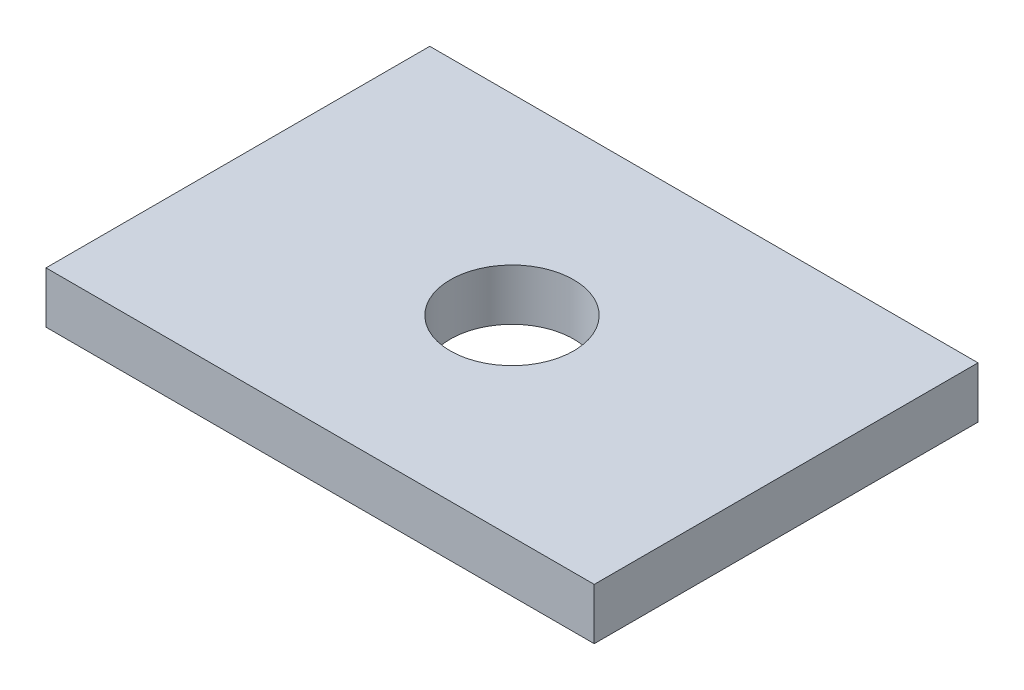
ISO-10303-21;
HEADER;
FILE_DESCRIPTION(('STEP AP214'),'2;1');
FILE_NAME('part.step','',(''),(''),'','','');
FILE_SCHEMA(('AUTOMOTIVE_DESIGN { 1 0 10303 214 1 1 1 1 }'));
ENDSEC;
DATA;
#1=APPLICATION_CONTEXT('core data for automotive mechanical design processes');
#2=APPLICATION_PROTOCOL_DEFINITION('international standard','automotive_design',2000,#1);
#3=PRODUCT_CONTEXT('',#1,'mechanical');
#4=PRODUCT('Part','Part','',(#3));
#5=PRODUCT_RELATED_PRODUCT_CATEGORY('part','',(#4));
#6=PRODUCT_DEFINITION_FORMATION('','',#4);
#7=PRODUCT_DEFINITION_CONTEXT('part definition',#1,'design');
#8=PRODUCT_DEFINITION('design','',#6,#7);
#9=PRODUCT_DEFINITION_SHAPE('','',#8);
#10=(LENGTH_UNIT() NAMED_UNIT(*) SI_UNIT(.MILLI.,.METRE.));
#11=(NAMED_UNIT(*) PLANE_ANGLE_UNIT() SI_UNIT($,.RADIAN.));
#12=(NAMED_UNIT(*) SI_UNIT($,.STERADIAN.) SOLID_ANGLE_UNIT());
#13=UNCERTAINTY_MEASURE_WITH_UNIT(LENGTH_MEASURE(1.E-05),#10,'distance_accuracy_value','');
#14=(GEOMETRIC_REPRESENTATION_CONTEXT(3) GLOBAL_UNCERTAINTY_ASSIGNED_CONTEXT((#13)) GLOBAL_UNIT_ASSIGNED_CONTEXT((#10,
#11,#12)) REPRESENTATION_CONTEXT('',''));
#15=CARTESIAN_POINT('',(0.,0.,0.));
#16=DIRECTION('',(0.,0.,1.));
#17=DIRECTION('',(1.,0.,0.));
#18=AXIS2_PLACEMENT_3D('',#15,#16,#17);
#19=CARTESIAN_POINT('',(0.,11.9062500000001,0.));
#20=DIRECTION('',(0.,-1.,0.));
#21=DIRECTION('',(0.,0.,-1.));
#22=AXIS2_PLACEMENT_3D('',#19,#20,#21);
#23=PLANE('',#22);
#24=DIRECTION('',(0.,0.,1.));
#25=VECTOR('',#24,1.);
#26=CARTESIAN_POINT('',(0.,11.9062500000001,0.));
#27=LINE('',#26,#25);
#28=CARTESIAN_POINT('',(0.,11.90625,-88.9));
#29=VERTEX_POINT('',#28);
#30=CARTESIAN_POINT('',(0.,11.9062500000001,0.));
#31=VERTEX_POINT('',#30);
#32=EDGE_CURVE('E85',#29,#31,#27,.T.);
#33=ORIENTED_EDGE('',*,*,#32,.T.);
#34=DIRECTION('',(1.,0.,0.));
#35=VECTOR('',#34,1.);
#36=CARTESIAN_POINT('',(0.,11.9062500000001,0.));
#37=LINE('',#36,#35);
#38=CARTESIAN_POINT('',(127.,11.9062500000001,0.));
#39=VERTEX_POINT('',#38);
#40=EDGE_CURVE('E80',#31,#39,#37,.T.);
#41=ORIENTED_EDGE('',*,*,#40,.T.);
#42=DIRECTION('',(0.,0.,-1.));
#43=VECTOR('',#42,1.);
#44=CARTESIAN_POINT('',(127.,11.9062500000001,0.));
#45=LINE('',#44,#43);
#46=CARTESIAN_POINT('',(127.,11.90625,-88.9));
#47=VERTEX_POINT('',#46);
#48=EDGE_CURVE('E83',#39,#47,#45,.T.);
#49=ORIENTED_EDGE('',*,*,#48,.T.);
#50=DIRECTION('',(-1.,0.,0.));
#51=VECTOR('',#50,1.);
#52=CARTESIAN_POINT('',(0.,11.90625,-88.9));
#53=LINE('',#52,#51);
#54=EDGE_CURVE('E50',#47,#29,#53,.T.);
#55=ORIENTED_EDGE('',*,*,#54,.T.);
#56=EDGE_LOOP('',(#33,#41,#49,#55));
#57=FACE_BOUND('',#56,.T.);
#58=CARTESIAN_POINT('',(63.5,11.90625,-44.45));
#59=DIRECTION('',(0.,1.,0.));
#60=DIRECTION('',(0.,0.,1.));
#61=AXIS2_PLACEMENT_3D('',#58,#59,#60);
#62=CIRCLE('',#61,14.2875);
#63=CARTESIAN_POINT('',(63.5,11.90625,-30.1625));
#64=VERTEX_POINT('',#63);
#65=EDGE_CURVE('E100',#64,#64,#62,.T.);
#66=ORIENTED_EDGE('',*,*,#65,.F.);
#67=EDGE_LOOP('',(#66));
#68=FACE_BOUND('',#67,.T.);
#69=ADVANCED_FACE('F33',(#57,#68),#23,.F.);
#70=CARTESIAN_POINT('',(0.,0.,0.));
#71=DIRECTION('',(0.,-1.,0.));
#72=DIRECTION('',(0.,0.,-1.));
#73=AXIS2_PLACEMENT_3D('',#70,#71,#72);
#74=PLANE('',#73);
#75=DIRECTION('',(0.,0.,1.));
#76=VECTOR('',#75,1.);
#77=CARTESIAN_POINT('',(0.,0.,0.));
#78=LINE('',#77,#76);
#79=CARTESIAN_POINT('',(0.,0.,-88.9));
#80=VERTEX_POINT('',#79);
#81=CARTESIAN_POINT('',(0.,0.,0.));
#82=VERTEX_POINT('',#81);
#83=EDGE_CURVE('E97',#80,#82,#78,.T.);
#84=ORIENTED_EDGE('',*,*,#83,.F.);
#85=DIRECTION('',(-1.,0.,0.));
#86=VECTOR('',#85,1.);
#87=CARTESIAN_POINT('',(0.,0.,-88.9));
#88=LINE('',#87,#86);
#89=CARTESIAN_POINT('',(127.,0.,-88.9));
#90=VERTEX_POINT('',#89);
#91=EDGE_CURVE('E73',#90,#80,#88,.T.);
#92=ORIENTED_EDGE('',*,*,#91,.F.);
#93=DIRECTION('',(0.,0.,-1.));
#94=VECTOR('',#93,1.);
#95=CARTESIAN_POINT('',(127.,0.,0.));
#96=LINE('',#95,#94);
#97=CARTESIAN_POINT('',(127.,0.,0.));
#98=VERTEX_POINT('',#97);
#99=EDGE_CURVE('E67',#98,#90,#96,.T.);
#100=ORIENTED_EDGE('',*,*,#99,.F.);
#101=DIRECTION('',(1.,0.,0.));
#102=VECTOR('',#101,1.);
#103=CARTESIAN_POINT('',(0.,0.,0.));
#104=LINE('',#103,#102);
#105=EDGE_CURVE('E89',#82,#98,#104,.T.);
#106=ORIENTED_EDGE('',*,*,#105,.F.);
#107=EDGE_LOOP('',(#84,#92,#100,#106));
#108=FACE_BOUND('',#107,.T.);
#109=CARTESIAN_POINT('',(63.5,0.,-44.45));
#110=DIRECTION('',(0.,1.,0.));
#111=DIRECTION('',(0.,0.,1.));
#112=AXIS2_PLACEMENT_3D('',#109,#110,#111);
#113=CIRCLE('',#112,14.2875);
#114=CARTESIAN_POINT('',(63.5,0.,-30.1625));
#115=VERTEX_POINT('',#114);
#116=EDGE_CURVE('E112',#115,#115,#113,.T.);
#117=ORIENTED_EDGE('',*,*,#116,.T.);
#118=EDGE_LOOP('',(#117));
#119=FACE_BOUND('',#118,.T.);
#120=ADVANCED_FACE('F108',(#108,#119),#74,.T.);
#121=CARTESIAN_POINT('',(0.,11.9062500000001,0.));
#122=DIRECTION('',(1.,0.,0.));
#123=DIRECTION('',(0.,0.,-1.));
#124=AXIS2_PLACEMENT_3D('',#121,#122,#123);
#125=PLANE('',#124);
#126=ORIENTED_EDGE('',*,*,#83,.T.);
#127=DIRECTION('',(0.,-1.,0.));
#128=VECTOR('',#127,1.);
#129=CARTESIAN_POINT('',(0.,11.9062500000001,0.));
#130=LINE('',#129,#128);
#131=EDGE_CURVE('E11',#31,#82,#130,.T.);
#132=ORIENTED_EDGE('',*,*,#131,.F.);
#133=ORIENTED_EDGE('',*,*,#32,.F.);
#134=DIRECTION('',(0.,-1.,0.));
#135=VECTOR('',#134,1.);
#136=CARTESIAN_POINT('',(0.,11.90625,-88.9));
#137=LINE('',#136,#135);
#138=EDGE_CURVE('E93',#29,#80,#137,.T.);
#139=ORIENTED_EDGE('',*,*,#138,.T.);
#140=EDGE_LOOP('',(#126,#132,#133,#139));
#141=FACE_BOUND('',#140,.T.);
#142=ADVANCED_FACE('F35',(#141),#125,.F.);
#143=CARTESIAN_POINT('',(0.,11.9062500000001,0.));
#144=DIRECTION('',(0.,0.,-1.));
#145=DIRECTION('',(-1.,0.,0.));
#146=AXIS2_PLACEMENT_3D('',#143,#144,#145);
#147=PLANE('',#146);
#148=ORIENTED_EDGE('',*,*,#105,.T.);
#149=DIRECTION('',(0.,-1.,0.));
#150=VECTOR('',#149,1.);
#151=CARTESIAN_POINT('',(127.,11.9062500000001,0.));
#152=LINE('',#151,#150);
#153=EDGE_CURVE('E42',#39,#98,#152,.T.);
#154=ORIENTED_EDGE('',*,*,#153,.F.);
#155=ORIENTED_EDGE('',*,*,#40,.F.);
#156=ORIENTED_EDGE('',*,*,#131,.T.);
#157=EDGE_LOOP('',(#148,#154,#155,#156));
#158=FACE_BOUND('',#157,.T.);
#159=ADVANCED_FACE('F88',(#158),#147,.F.);
#160=CARTESIAN_POINT('',(127.,11.9062500000001,0.));
#161=DIRECTION('',(-1.,0.,0.));
#162=DIRECTION('',(0.,0.,1.));
#163=AXIS2_PLACEMENT_3D('',#160,#161,#162);
#164=PLANE('',#163);
#165=ORIENTED_EDGE('',*,*,#99,.T.);
#166=DIRECTION('',(0.,-1.,0.));
#167=VECTOR('',#166,1.);
#168=CARTESIAN_POINT('',(127.,11.90625,-88.9));
#169=LINE('',#168,#167);
#170=EDGE_CURVE('E90',#47,#90,#169,.T.);
#171=ORIENTED_EDGE('',*,*,#170,.F.);
#172=ORIENTED_EDGE('',*,*,#48,.F.);
#173=ORIENTED_EDGE('',*,*,#153,.T.);
#174=EDGE_LOOP('',(#165,#171,#172,#173));
#175=FACE_BOUND('',#174,.T.);
#176=ADVANCED_FACE('F91',(#175),#164,.F.);
#177=CARTESIAN_POINT('',(0.,11.90625,-88.9));
#178=DIRECTION('',(0.,0.,1.));
#179=DIRECTION('',(1.,0.,0.));
#180=AXIS2_PLACEMENT_3D('',#177,#178,#179);
#181=PLANE('',#180);
#182=ORIENTED_EDGE('',*,*,#91,.T.);
#183=ORIENTED_EDGE('',*,*,#138,.F.);
#184=ORIENTED_EDGE('',*,*,#54,.F.);
#185=ORIENTED_EDGE('',*,*,#170,.T.);
#186=EDGE_LOOP('',(#182,#183,#184,#185));
#187=FACE_BOUND('',#186,.T.);
#188=ADVANCED_FACE('F105',(#187),#181,.F.);
#189=CARTESIAN_POINT('',(63.5,11.90625,-44.45));
#190=DIRECTION('',(0.,-1.,0.));
#191=DIRECTION('',(0.,0.,-1.));
#192=AXIS2_PLACEMENT_3D('',#189,#190,#191);
#193=CYLINDRICAL_SURFACE('',#192,14.2875);
#194=ORIENTED_EDGE('',*,*,#65,.T.);
#195=EDGE_LOOP('',(#194));
#196=FACE_BOUND('',#195,.T.);
#197=ORIENTED_EDGE('',*,*,#116,.F.);
#198=EDGE_LOOP('',(#197));
#199=FACE_BOUND('',#198,.T.);
#200=ADVANCED_FACE('F118',(#196,#199),#193,.F.);
#201=CLOSED_SHELL('',(#69,#120,#142,#159,#176,#188,#200));
#202=MANIFOLD_SOLID_BREP('B2',#201);
#203=ADVANCED_BREP_SHAPE_REPRESENTATION('',(#18,#202),#14);
#204=SHAPE_DEFINITION_REPRESENTATION(#9,#203);
ENDSEC;
END-ISO-10303-21;
